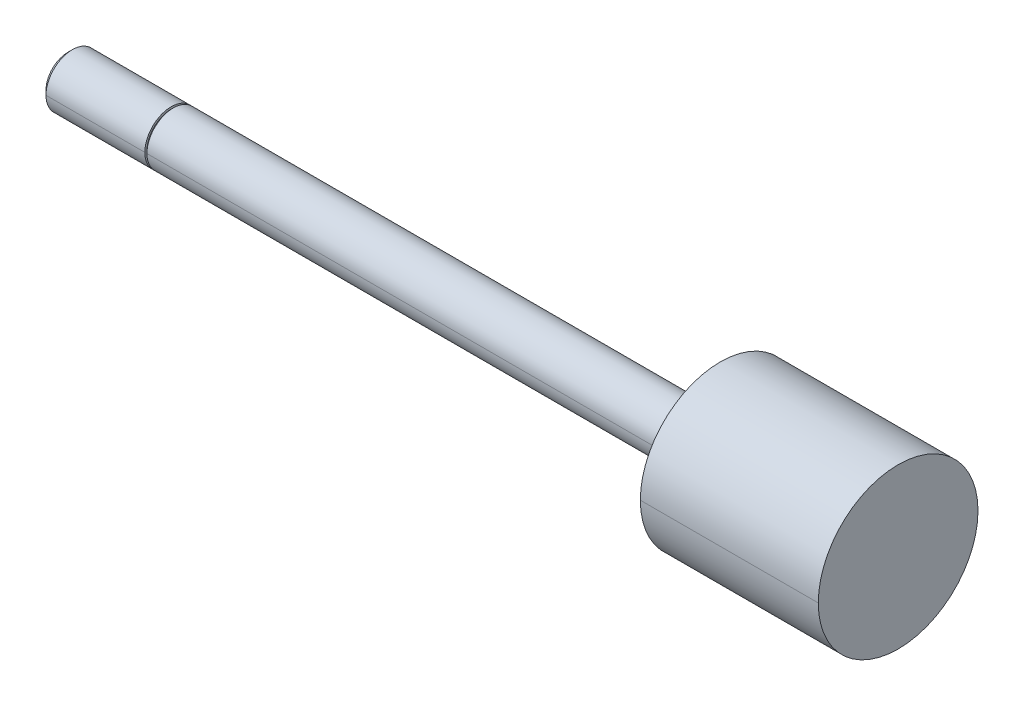
ISO-10303-21;
HEADER;
FILE_DESCRIPTION(('STEP AP214'),'2;1');
FILE_NAME('part.step','',(''),(''),'','','');
FILE_SCHEMA(('AUTOMOTIVE_DESIGN { 1 0 10303 214 1 1 1 1 }'));
ENDSEC;
DATA;
#1=APPLICATION_CONTEXT('core data for automotive mechanical design processes');
#2=APPLICATION_PROTOCOL_DEFINITION('international standard','automotive_design',2000,#1);
#3=PRODUCT_CONTEXT('',#1,'mechanical');
#4=PRODUCT('Part','Part','',(#3));
#5=PRODUCT_RELATED_PRODUCT_CATEGORY('part','',(#4));
#6=PRODUCT_DEFINITION_FORMATION('','',#4);
#7=PRODUCT_DEFINITION_CONTEXT('part definition',#1,'design');
#8=PRODUCT_DEFINITION('design','',#6,#7);
#9=PRODUCT_DEFINITION_SHAPE('','',#8);
#10=(LENGTH_UNIT() NAMED_UNIT(*) SI_UNIT(.MILLI.,.METRE.));
#11=(NAMED_UNIT(*) PLANE_ANGLE_UNIT() SI_UNIT($,.RADIAN.));
#12=(NAMED_UNIT(*) SI_UNIT($,.STERADIAN.) SOLID_ANGLE_UNIT());
#13=UNCERTAINTY_MEASURE_WITH_UNIT(LENGTH_MEASURE(1.E-05),#10,'distance_accuracy_value','');
#14=(GEOMETRIC_REPRESENTATION_CONTEXT(3) GLOBAL_UNCERTAINTY_ASSIGNED_CONTEXT((#13)) GLOBAL_UNIT_ASSIGNED_CONTEXT((#10,
#11,#12)) REPRESENTATION_CONTEXT('',''));
#15=CARTESIAN_POINT('',(0.,0.,0.));
#16=DIRECTION('',(0.,0.,1.));
#17=DIRECTION('',(1.,0.,0.));
#18=AXIS2_PLACEMENT_3D('',#15,#16,#17);
#19=CARTESIAN_POINT('',(0.,0.,0.));
#20=DIRECTION('',(-1.,0.,0.));
#21=DIRECTION('',(0.,-1.,0.));
#22=AXIS2_PLACEMENT_3D('',#19,#20,#21);
#23=CYLINDRICAL_SURFACE('',#22,2.921);
#24=CARTESIAN_POINT('',(0.,0.,0.));
#25=DIRECTION('',(1.,0.,0.));
#26=DIRECTION('',(0.,0.,-1.));
#27=AXIS2_PLACEMENT_3D('',#24,#25,#26);
#28=CIRCLE('',#27,2.921);
#29=CARTESIAN_POINT('',(0.,0.,-2.921));
#30=VERTEX_POINT('',#29);
#31=CARTESIAN_POINT('',(0.,0.,2.921));
#32=VERTEX_POINT('',#31);
#33=EDGE_CURVE('E13',#30,#32,#28,.T.);
#34=ORIENTED_EDGE('',*,*,#33,.F.);
#35=DIRECTION('',(-1.,0.,0.));
#36=VECTOR('',#35,1.);
#37=CARTESIAN_POINT('',(0.,0.,-2.921));
#38=LINE('',#37,#36);
#39=CARTESIAN_POINT('',(-0.254,0.,-2.921));
#40=VERTEX_POINT('',#39);
#41=EDGE_CURVE('E32',#30,#40,#38,.T.);
#42=ORIENTED_EDGE('',*,*,#41,.T.);
#43=CARTESIAN_POINT('',(-0.254,0.,0.));
#44=DIRECTION('',(1.,0.,0.));
#45=DIRECTION('',(0.,0.,-1.));
#46=AXIS2_PLACEMENT_3D('',#43,#44,#45);
#47=CIRCLE('',#46,2.921);
#48=CARTESIAN_POINT('',(-0.254,0.,2.921));
#49=VERTEX_POINT('',#48);
#50=EDGE_CURVE('E218',#40,#49,#47,.T.);
#51=ORIENTED_EDGE('',*,*,#50,.T.);
#52=DIRECTION('',(-1.,0.,0.));
#53=VECTOR('',#52,1.);
#54=CARTESIAN_POINT('',(0.,0.,2.921));
#55=LINE('',#54,#53);
#56=EDGE_CURVE('E213',#32,#49,#55,.T.);
#57=ORIENTED_EDGE('',*,*,#56,.F.);
#58=EDGE_LOOP('',(#34,#42,#51,#57));
#59=FACE_BOUND('',#58,.T.);
#60=ADVANCED_FACE('F24',(#59),#23,.T.);
#61=CARTESIAN_POINT('',(0.,0.,0.));
#62=DIRECTION('',(-1.,0.,0.));
#63=DIRECTION('',(0.,1.,0.));
#64=AXIS2_PLACEMENT_3D('',#61,#62,#63);
#65=CYLINDRICAL_SURFACE('',#64,2.921);
#66=CARTESIAN_POINT('',(-0.254,0.,0.));
#67=DIRECTION('',(1.,0.,0.));
#68=DIRECTION('',(0.,0.,-1.));
#69=AXIS2_PLACEMENT_3D('',#66,#67,#68);
#70=CIRCLE('',#69,2.921);
#71=EDGE_CURVE('E209',#49,#40,#70,.T.);
#72=ORIENTED_EDGE('',*,*,#71,.T.);
#73=ORIENTED_EDGE('',*,*,#41,.F.);
#74=CARTESIAN_POINT('',(0.,0.,0.));
#75=DIRECTION('',(1.,0.,0.));
#76=DIRECTION('',(0.,0.,-1.));
#77=AXIS2_PLACEMENT_3D('',#74,#75,#76);
#78=CIRCLE('',#77,2.921);
#79=EDGE_CURVE('E204',#32,#30,#78,.T.);
#80=ORIENTED_EDGE('',*,*,#79,.F.);
#81=ORIENTED_EDGE('',*,*,#56,.T.);
#82=EDGE_LOOP('',(#72,#73,#80,#81));
#83=FACE_BOUND('',#82,.T.);
#84=ADVANCED_FACE('F231',(#83),#65,.T.);
#85=CARTESIAN_POINT('',(0.,2.921,0.));
#86=DIRECTION('',(1.,0.,0.));
#87=DIRECTION('',(0.,0.,-1.));
#88=AXIS2_PLACEMENT_3D('',#85,#86,#87);
#89=PLANE('',#88);
#90=CARTESIAN_POINT('',(0.,0.,0.));
#91=DIRECTION('',(1.,0.,0.));
#92=DIRECTION('',(0.,0.,-1.));
#93=AXIS2_PLACEMENT_3D('',#90,#91,#92);
#94=CIRCLE('',#93,3.175);
#95=CARTESIAN_POINT('',(0.,0.,-3.175));
#96=VERTEX_POINT('',#95);
#97=CARTESIAN_POINT('',(0.,0.,3.175));
#98=VERTEX_POINT('',#97);
#99=EDGE_CURVE('E199',#96,#98,#94,.T.);
#100=ORIENTED_EDGE('',*,*,#99,.F.);
#101=CARTESIAN_POINT('',(0.,0.,0.));
#102=DIRECTION('',(1.,0.,0.));
#103=DIRECTION('',(0.,0.,-1.));
#104=AXIS2_PLACEMENT_3D('',#101,#102,#103);
#105=CIRCLE('',#104,3.175);
#106=EDGE_CURVE('E194',#98,#96,#105,.T.);
#107=ORIENTED_EDGE('',*,*,#106,.F.);
#108=EDGE_LOOP('',(#100,#107));
#109=FACE_BOUND('',#108,.T.);
#110=ORIENTED_EDGE('',*,*,#33,.T.);
#111=ORIENTED_EDGE('',*,*,#79,.T.);
#112=EDGE_LOOP('',(#110,#111));
#113=FACE_BOUND('',#112,.T.);
#114=ADVANCED_FACE('F256',(#109,#113),#89,.F.);
#115=CARTESIAN_POINT('',(87.3252,0.,0.));
#116=DIRECTION('',(-1.,0.,0.));
#117=DIRECTION('',(0.,1.,0.));
#118=AXIS2_PLACEMENT_3D('',#115,#116,#117);
#119=CYLINDRICAL_SURFACE('',#118,3.175);
#120=ORIENTED_EDGE('',*,*,#106,.T.);
#121=DIRECTION('',(-1.,0.,0.));
#122=VECTOR('',#121,1.);
#123=CARTESIAN_POINT('',(65.8876,0.,-3.175));
#124=LINE('',#123,#122);
#125=CARTESIAN_POINT('',(65.8876,0.,-3.175));
#126=VERTEX_POINT('',#125);
#127=EDGE_CURVE('E189',#126,#96,#124,.T.);
#128=ORIENTED_EDGE('',*,*,#127,.F.);
#129=CARTESIAN_POINT('',(65.8876,0.,0.));
#130=DIRECTION('',(1.,0.,0.));
#131=DIRECTION('',(0.,0.,-1.));
#132=AXIS2_PLACEMENT_3D('',#129,#130,#131);
#133=CIRCLE('',#132,3.175);
#134=CARTESIAN_POINT('',(65.8876,0.,3.175));
#135=VERTEX_POINT('',#134);
#136=EDGE_CURVE('E184',#135,#126,#133,.T.);
#137=ORIENTED_EDGE('',*,*,#136,.F.);
#138=DIRECTION('',(-1.,0.,0.));
#139=VECTOR('',#138,1.);
#140=CARTESIAN_POINT('',(65.8876,0.,3.175));
#141=LINE('',#140,#139);
#142=EDGE_CURVE('E179',#135,#98,#141,.T.);
#143=ORIENTED_EDGE('',*,*,#142,.T.);
#144=EDGE_LOOP('',(#120,#128,#137,#143));
#145=FACE_BOUND('',#144,.T.);
#146=ADVANCED_FACE('F260',(#145),#119,.T.);
#147=CARTESIAN_POINT('',(87.3252,0.,0.));
#148=DIRECTION('',(-1.,0.,0.));
#149=DIRECTION('',(0.,-1.,0.));
#150=AXIS2_PLACEMENT_3D('',#147,#148,#149);
#151=CYLINDRICAL_SURFACE('',#150,3.175);
#152=CARTESIAN_POINT('',(65.8876,0.,0.));
#153=DIRECTION('',(1.,0.,0.));
#154=DIRECTION('',(0.,0.,-1.));
#155=AXIS2_PLACEMENT_3D('',#152,#153,#154);
#156=CIRCLE('',#155,3.175);
#157=EDGE_CURVE('E174',#126,#135,#156,.T.);
#158=ORIENTED_EDGE('',*,*,#157,.F.);
#159=ORIENTED_EDGE('',*,*,#127,.T.);
#160=ORIENTED_EDGE('',*,*,#99,.T.);
#161=ORIENTED_EDGE('',*,*,#142,.F.);
#162=EDGE_LOOP('',(#158,#159,#160,#161));
#163=FACE_BOUND('',#162,.T.);
#164=ADVANCED_FACE('F266',(#163),#151,.T.);
#165=CARTESIAN_POINT('',(65.8876,3.175,0.));
#166=DIRECTION('',(1.,0.,0.));
#167=DIRECTION('',(0.,0.,-1.));
#168=AXIS2_PLACEMENT_3D('',#165,#166,#167);
#169=PLANE('',#168);
#170=CARTESIAN_POINT('',(65.8876,0.,0.));
#171=DIRECTION('',(1.,0.,0.));
#172=DIRECTION('',(0.,0.,-1.));
#173=AXIS2_PLACEMENT_3D('',#170,#171,#172);
#174=CIRCLE('',#173,9.62025);
#175=CARTESIAN_POINT('',(65.8876,0.,-9.62025));
#176=VERTEX_POINT('',#175);
#177=CARTESIAN_POINT('',(65.8876,0.,9.62025));
#178=VERTEX_POINT('',#177);
#179=EDGE_CURVE('E169',#176,#178,#174,.T.);
#180=ORIENTED_EDGE('',*,*,#179,.F.);
#181=CARTESIAN_POINT('',(65.8876,0.,0.));
#182=DIRECTION('',(1.,0.,0.));
#183=DIRECTION('',(0.,0.,-1.));
#184=AXIS2_PLACEMENT_3D('',#181,#182,#183);
#185=CIRCLE('',#184,9.62025);
#186=EDGE_CURVE('E164',#178,#176,#185,.T.);
#187=ORIENTED_EDGE('',*,*,#186,.F.);
#188=EDGE_LOOP('',(#180,#187));
#189=FACE_BOUND('',#188,.T.);
#190=ORIENTED_EDGE('',*,*,#157,.T.);
#191=ORIENTED_EDGE('',*,*,#136,.T.);
#192=EDGE_LOOP('',(#190,#191));
#193=FACE_BOUND('',#192,.T.);
#194=ADVANCED_FACE('F270',(#189,#193),#169,.F.);
#195=CARTESIAN_POINT('',(87.3252,0.,0.));
#196=DIRECTION('',(-1.,0.,0.));
#197=DIRECTION('',(0.,1.,0.));
#198=AXIS2_PLACEMENT_3D('',#195,#196,#197);
#199=CYLINDRICAL_SURFACE('',#198,9.62025);
#200=ORIENTED_EDGE('',*,*,#186,.T.);
#201=DIRECTION('',(-1.,0.,0.));
#202=VECTOR('',#201,1.);
#203=CARTESIAN_POINT('',(87.3252,0.,-9.62025));
#204=LINE('',#203,#202);
#205=CARTESIAN_POINT('',(87.3252,0.,-9.62025));
#206=VERTEX_POINT('',#205);
#207=EDGE_CURVE('E159',#206,#176,#204,.T.);
#208=ORIENTED_EDGE('',*,*,#207,.F.);
#209=CARTESIAN_POINT('',(87.3252,0.,0.));
#210=DIRECTION('',(1.,0.,0.));
#211=DIRECTION('',(0.,0.,-1.));
#212=AXIS2_PLACEMENT_3D('',#209,#210,#211);
#213=CIRCLE('',#212,9.62025);
#214=CARTESIAN_POINT('',(87.3252,0.,9.62025));
#215=VERTEX_POINT('',#214);
#216=EDGE_CURVE('E154',#215,#206,#213,.T.);
#217=ORIENTED_EDGE('',*,*,#216,.F.);
#218=DIRECTION('',(-1.,0.,0.));
#219=VECTOR('',#218,1.);
#220=CARTESIAN_POINT('',(87.3252,0.,9.62025));
#221=LINE('',#220,#219);
#222=EDGE_CURVE('E149',#215,#178,#221,.T.);
#223=ORIENTED_EDGE('',*,*,#222,.T.);
#224=EDGE_LOOP('',(#200,#208,#217,#223));
#225=FACE_BOUND('',#224,.T.);
#226=ADVANCED_FACE('F274',(#225),#199,.T.);
#227=CARTESIAN_POINT('',(87.3252,0.,0.));
#228=DIRECTION('',(-1.,0.,0.));
#229=DIRECTION('',(0.,-1.,0.));
#230=AXIS2_PLACEMENT_3D('',#227,#228,#229);
#231=CYLINDRICAL_SURFACE('',#230,9.62025);
#232=CARTESIAN_POINT('',(87.3252,0.,0.));
#233=DIRECTION('',(1.,0.,0.));
#234=DIRECTION('',(0.,0.,-1.));
#235=AXIS2_PLACEMENT_3D('',#232,#233,#234);
#236=CIRCLE('',#235,9.62025);
#237=EDGE_CURVE('E144',#206,#215,#236,.T.);
#238=ORIENTED_EDGE('',*,*,#237,.F.);
#239=ORIENTED_EDGE('',*,*,#207,.T.);
#240=ORIENTED_EDGE('',*,*,#179,.T.);
#241=ORIENTED_EDGE('',*,*,#222,.F.);
#242=EDGE_LOOP('',(#238,#239,#240,#241));
#243=FACE_BOUND('',#242,.T.);
#244=ADVANCED_FACE('F278',(#243),#231,.T.);
#245=CARTESIAN_POINT('',(87.3252,9.62025,0.));
#246=DIRECTION('',(-1.,0.,0.));
#247=DIRECTION('',(0.,0.,1.));
#248=AXIS2_PLACEMENT_3D('',#245,#246,#247);
#249=PLANE('',#248);
#250=ORIENTED_EDGE('',*,*,#237,.T.);
#251=ORIENTED_EDGE('',*,*,#216,.T.);
#252=EDGE_LOOP('',(#250,#251));
#253=FACE_BOUND('',#252,.T.);
#254=ADVANCED_FACE('F236',(#253),#249,.F.);
#255=CARTESIAN_POINT('',(-0.254,3.429,0.));
#256=DIRECTION('',(-1.,0.,0.));
#257=DIRECTION('',(0.,0.,1.));
#258=AXIS2_PLACEMENT_3D('',#255,#256,#257);
#259=PLANE('',#258);
#260=ORIENTED_EDGE('',*,*,#50,.F.);
#261=ORIENTED_EDGE('',*,*,#71,.F.);
#262=EDGE_LOOP('',(#260,#261));
#263=FACE_BOUND('',#262,.T.);
#264=CARTESIAN_POINT('',(-0.254000000000005,0.,0.));
#265=DIRECTION('',(-1.,0.,0.));
#266=DIRECTION('',(0.,0.,1.));
#267=AXIS2_PLACEMENT_3D('',#264,#265,#266);
#268=CIRCLE('',#267,3.175);
#269=CARTESIAN_POINT('',(-0.254000000000005,0.,3.175));
#270=VERTEX_POINT('',#269);
#271=CARTESIAN_POINT('',(-0.254000000000005,0.,-3.175));
#272=VERTEX_POINT('',#271);
#273=EDGE_CURVE('E139',#270,#272,#268,.T.);
#274=ORIENTED_EDGE('',*,*,#273,.F.);
#275=CARTESIAN_POINT('',(-0.254000000000005,0.,0.));
#276=DIRECTION('',(-1.,0.,0.));
#277=DIRECTION('',(0.,0.,1.));
#278=AXIS2_PLACEMENT_3D('',#275,#276,#277);
#279=CIRCLE('',#278,3.175);
#280=EDGE_CURVE('E134',#272,#270,#279,.T.);
#281=ORIENTED_EDGE('',*,*,#280,.F.);
#282=EDGE_LOOP('',(#274,#281));
#283=FACE_BOUND('',#282,.T.);
#284=ADVANCED_FACE('F232',(#263,#283),#259,.F.);
#285=CARTESIAN_POINT('',(87.3252,0.,0.));
#286=DIRECTION('',(-1.,0.,0.));
#287=DIRECTION('',(0.,1.,0.));
#288=AXIS2_PLACEMENT_3D('',#285,#286,#287);
#289=CYLINDRICAL_SURFACE('',#288,3.175);
#290=CARTESIAN_POINT('',(-12.15898,0.,0.));
#291=DIRECTION('',(1.,0.,0.));
#292=DIRECTION('',(0.,0.,-1.));
#293=AXIS2_PLACEMENT_3D('',#290,#291,#292);
#294=CIRCLE('',#293,3.175);
#295=CARTESIAN_POINT('',(-12.15898,0.,3.175));
#296=VERTEX_POINT('',#295);
#297=CARTESIAN_POINT('',(-12.15898,0.,-3.175));
#298=VERTEX_POINT('',#297);
#299=EDGE_CURVE('E105',#296,#298,#294,.T.);
#300=ORIENTED_EDGE('',*,*,#299,.T.);
#301=DIRECTION('',(-1.,0.,0.));
#302=VECTOR('',#301,1.);
#303=CARTESIAN_POINT('',(-0.254000000000005,0.,-3.175));
#304=LINE('',#303,#302);
#305=EDGE_CURVE('E126',#272,#298,#304,.T.);
#306=ORIENTED_EDGE('',*,*,#305,.F.);
#307=ORIENTED_EDGE('',*,*,#280,.T.);
#308=DIRECTION('',(-1.,0.,0.));
#309=VECTOR('',#308,1.);
#310=CARTESIAN_POINT('',(-0.254000000000005,0.,3.175));
#311=LINE('',#310,#309);
#312=EDGE_CURVE('E122',#270,#296,#311,.T.);
#313=ORIENTED_EDGE('',*,*,#312,.T.);
#314=EDGE_LOOP('',(#300,#306,#307,#313));
#315=FACE_BOUND('',#314,.T.);
#316=ADVANCED_FACE('F235',(#315),#289,.T.);
#317=CARTESIAN_POINT('',(87.3252,0.,0.));
#318=DIRECTION('',(-1.,0.,0.));
#319=DIRECTION('',(0.,-1.,0.));
#320=AXIS2_PLACEMENT_3D('',#317,#318,#319);
#321=CYLINDRICAL_SURFACE('',#320,3.175);
#322=ORIENTED_EDGE('',*,*,#273,.T.);
#323=ORIENTED_EDGE('',*,*,#305,.T.);
#324=CARTESIAN_POINT('',(-12.15898,0.,0.));
#325=DIRECTION('',(1.,0.,0.));
#326=DIRECTION('',(0.,0.,-1.));
#327=AXIS2_PLACEMENT_3D('',#324,#325,#326);
#328=CIRCLE('',#327,3.175);
#329=EDGE_CURVE('E117',#298,#296,#328,.T.);
#330=ORIENTED_EDGE('',*,*,#329,.T.);
#331=ORIENTED_EDGE('',*,*,#312,.F.);
#332=EDGE_LOOP('',(#322,#323,#330,#331));
#333=FACE_BOUND('',#332,.T.);
#334=ADVANCED_FACE('F242',(#333),#321,.T.);
#335=CARTESIAN_POINT('',(-12.7,0.,0.));
#336=DIRECTION('',(1.,0.,0.));
#337=DIRECTION('',(0.,-1.,0.));
#338=AXIS2_PLACEMENT_3D('',#335,#336,#337);
#339=CONICAL_SURFACE('',#338,2.63398,0.7853981634);
#340=ORIENTED_EDGE('',*,*,#329,.F.);
#341=DIRECTION('',(0.707106781184742,0.,-0.707106781188353));
#342=VECTOR('',#341,1.);
#343=CARTESIAN_POINT('',(-12.7,0.,-2.63398));
#344=LINE('',#343,#342);
#345=CARTESIAN_POINT('',(-12.7,0.,-2.63398));
#346=VERTEX_POINT('',#345);
#347=EDGE_CURVE('E97',#346,#298,#344,.T.);
#348=ORIENTED_EDGE('',*,*,#347,.F.);
#349=CARTESIAN_POINT('',(-12.7,0.,0.));
#350=DIRECTION('',(1.,0.,0.));
#351=DIRECTION('',(0.,0.,-1.));
#352=AXIS2_PLACEMENT_3D('',#349,#350,#351);
#353=CIRCLE('',#352,2.63398);
#354=CARTESIAN_POINT('',(-12.7,0.,2.63398));
#355=VERTEX_POINT('',#354);
#356=EDGE_CURVE('E90',#346,#355,#353,.T.);
#357=ORIENTED_EDGE('',*,*,#356,.T.);
#358=DIRECTION('',(0.707106781184742,0.,0.707106781188353));
#359=VECTOR('',#358,1.);
#360=CARTESIAN_POINT('',(-12.7,0.,2.63398));
#361=LINE('',#360,#359);
#362=EDGE_CURVE('E94',#355,#296,#361,.T.);
#363=ORIENTED_EDGE('',*,*,#362,.T.);
#364=EDGE_LOOP('',(#340,#348,#357,#363));
#365=FACE_BOUND('',#364,.T.);
#366=ADVANCED_FACE('F93',(#365),#339,.T.);
#367=CARTESIAN_POINT('',(-12.7,0.,0.));
#368=DIRECTION('',(1.,0.,0.));
#369=DIRECTION('',(0.,1.,0.));
#370=AXIS2_PLACEMENT_3D('',#367,#368,#369);
#371=CONICAL_SURFACE('',#370,2.63398,0.7853981634);
#372=CARTESIAN_POINT('',(-12.7,0.,0.));
#373=DIRECTION('',(1.,0.,0.));
#374=DIRECTION('',(0.,0.,-1.));
#375=AXIS2_PLACEMENT_3D('',#372,#373,#374);
#376=CIRCLE('',#375,2.63398);
#377=EDGE_CURVE('E104',#355,#346,#376,.T.);
#378=ORIENTED_EDGE('',*,*,#377,.T.);
#379=ORIENTED_EDGE('',*,*,#347,.T.);
#380=ORIENTED_EDGE('',*,*,#299,.F.);
#381=ORIENTED_EDGE('',*,*,#362,.F.);
#382=EDGE_LOOP('',(#378,#379,#380,#381));
#383=FACE_BOUND('',#382,.T.);
#384=ADVANCED_FACE('F103',(#383),#371,.T.);
#385=CARTESIAN_POINT('',(-12.7,0.,0.));
#386=DIRECTION('',(1.,0.,0.));
#387=DIRECTION('',(0.,0.,-1.));
#388=AXIS2_PLACEMENT_3D('',#385,#386,#387);
#389=PLANE('',#388);
#390=ORIENTED_EDGE('',*,*,#356,.F.);
#391=ORIENTED_EDGE('',*,*,#377,.F.);
#392=EDGE_LOOP('',(#390,#391));
#393=FACE_BOUND('',#392,.T.);
#394=ADVANCED_FACE('F107',(#393),#389,.F.);
#395=CLOSED_SHELL('',(#60,#84,#114,#146,#164,#194,#226,#244,#254,#284,#316,#334,#366,#384,#394));
#396=MANIFOLD_SOLID_BREP('B1',#395);
#397=ADVANCED_BREP_SHAPE_REPRESENTATION('',(#18,#396),#14);
#398=SHAPE_DEFINITION_REPRESENTATION(#9,#397);
ENDSEC;
END-ISO-10303-21;
